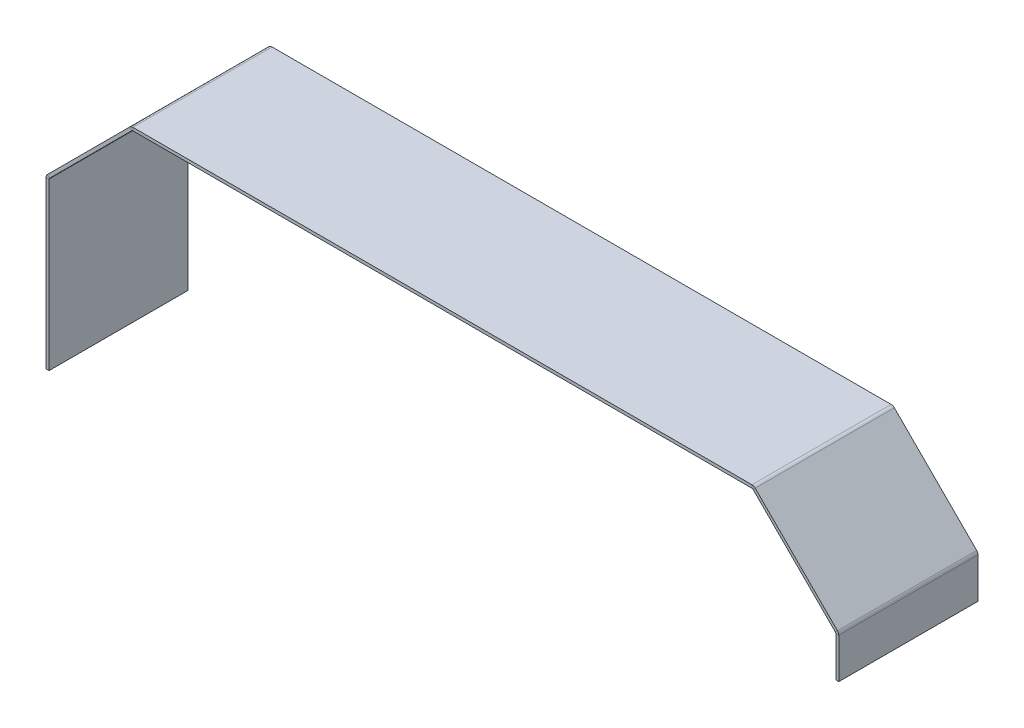
ISO-10303-21;
HEADER;
FILE_DESCRIPTION(('STEP AP214'),'2;1');
FILE_NAME('part.step','',(''),(''),'','','');
FILE_SCHEMA(('AUTOMOTIVE_DESIGN { 1 0 10303 214 1 1 1 1 }'));
ENDSEC;
DATA;
#1=APPLICATION_CONTEXT('core data for automotive mechanical design processes');
#2=APPLICATION_PROTOCOL_DEFINITION('international standard','automotive_design',2000,#1);
#3=PRODUCT_CONTEXT('',#1,'mechanical');
#4=PRODUCT('Part','Part','',(#3));
#5=PRODUCT_RELATED_PRODUCT_CATEGORY('part','',(#4));
#6=PRODUCT_DEFINITION_FORMATION('','',#4);
#7=PRODUCT_DEFINITION_CONTEXT('part definition',#1,'design');
#8=PRODUCT_DEFINITION('design','',#6,#7);
#9=PRODUCT_DEFINITION_SHAPE('','',#8);
#10=(LENGTH_UNIT() NAMED_UNIT(*) SI_UNIT(.MILLI.,.METRE.));
#11=(NAMED_UNIT(*) PLANE_ANGLE_UNIT() SI_UNIT($,.RADIAN.));
#12=(NAMED_UNIT(*) SI_UNIT($,.STERADIAN.) SOLID_ANGLE_UNIT());
#13=UNCERTAINTY_MEASURE_WITH_UNIT(LENGTH_MEASURE(1.E-05),#10,'distance_accuracy_value','');
#14=(GEOMETRIC_REPRESENTATION_CONTEXT(3) GLOBAL_UNCERTAINTY_ASSIGNED_CONTEXT((#13)) GLOBAL_UNIT_ASSIGNED_CONTEXT((#10,
#11,#12)) REPRESENTATION_CONTEXT('',''));
#15=CARTESIAN_POINT('',(0.,0.,0.));
#16=DIRECTION('',(0.,0.,1.));
#17=DIRECTION('',(1.,0.,0.));
#18=AXIS2_PLACEMENT_3D('',#15,#16,#17);
#19=CARTESIAN_POINT('',(465.,0.,0.));
#20=DIRECTION('',(0.,0.,1.));
#21=DIRECTION('',(-0.707106781186547,0.707106781186548,0.));
#22=AXIS2_PLACEMENT_3D('',#19,#20,#21);
#23=PLANE('',#22);
#24=DIRECTION('',(0.707106781186548,0.707106781186547,0.));
#25=VECTOR('',#24,1.);
#26=CARTESIAN_POINT('',(519.707106781187,-54.7071067811866,0.));
#27=LINE('',#26,#25);
#28=CARTESIAN_POINT('',(519.707106781187,-54.7071067811866,0.));
#29=VERTEX_POINT('',#28);
#30=CARTESIAN_POINT('',(521.12132034356,-53.2928932188135,0.));
#31=VERTEX_POINT('',#30);
#32=EDGE_CURVE('E11',#29,#31,#27,.T.);
#33=ORIENTED_EDGE('',*,*,#32,.F.);
#34=DIRECTION('',(-0.707106781186547,0.707106781186548,0.));
#35=VECTOR('',#34,1.);
#36=CARTESIAN_POINT('',(465.,0.,0.));
#37=LINE('',#36,#35);
#38=CARTESIAN_POINT('',(465.292893218813,-0.292893218813435,0.));
#39=VERTEX_POINT('',#38);
#40=EDGE_CURVE('E292',#29,#39,#37,.T.);
#41=ORIENTED_EDGE('',*,*,#40,.T.);
#42=DIRECTION('',(0.707106781186524,0.707106781186571,0.));
#43=VECTOR('',#42,1.);
#44=CARTESIAN_POINT('',(465.292893218813,-0.292893218813435,0.));
#45=LINE('',#44,#43);
#46=CARTESIAN_POINT('',(466.707106781187,1.12132034355966,0.));
#47=VERTEX_POINT('',#46);
#48=EDGE_CURVE('E55',#39,#47,#45,.T.);
#49=ORIENTED_EDGE('',*,*,#48,.T.);
#50=DIRECTION('',(0.707106781186547,-0.707106781186548,0.));
#51=VECTOR('',#50,1.);
#52=CARTESIAN_POINT('',(466.414213562373,1.41421356237309,0.));
#53=LINE('',#52,#51);
#54=EDGE_CURVE('E231',#31,#47,#53,.F.);
#55=ORIENTED_EDGE('',*,*,#54,.F.);
#56=EDGE_LOOP('',(#33,#41,#49,#55));
#57=FACE_BOUND('',#56,.T.);
#58=ADVANCED_FACE('F45',(#57),#23,.F.);
#59=CARTESIAN_POINT('',(464.585786437627,-1.,0.));
#60=DIRECTION('',(0.,0.,1.));
#61=DIRECTION('',(1.,0.,0.));
#62=AXIS2_PLACEMENT_3D('',#59,#60,#61);
#63=PLANE('',#62);
#64=ORIENTED_EDGE('',*,*,#48,.F.);
#65=CARTESIAN_POINT('',(464.585786437627,-1.,0.));
#66=DIRECTION('',(0.,0.,-1.));
#67=DIRECTION('',(-1.,0.,0.));
#68=AXIS2_PLACEMENT_3D('',#65,#66,#67);
#69=CIRCLE('',#68,1.);
#70=CARTESIAN_POINT('',(464.585786437627,0.,0.));
#71=VERTEX_POINT('',#70);
#72=EDGE_CURVE('E323',#39,#71,#69,.F.);
#73=ORIENTED_EDGE('',*,*,#72,.T.);
#74=DIRECTION('',(0.,1.,0.));
#75=VECTOR('',#74,1.);
#76=CARTESIAN_POINT('',(464.585786437627,0.,0.));
#77=LINE('',#76,#75);
#78=CARTESIAN_POINT('',(464.585786437627,2.,0.));
#79=VERTEX_POINT('',#78);
#80=EDGE_CURVE('E375',#71,#79,#77,.T.);
#81=ORIENTED_EDGE('',*,*,#80,.T.);
#82=CARTESIAN_POINT('',(464.585786437627,-1.,0.));
#83=DIRECTION('',(0.,0.,-1.));
#84=DIRECTION('',(-1.,0.,0.));
#85=AXIS2_PLACEMENT_3D('',#82,#83,#84);
#86=CIRCLE('',#85,3.);
#87=EDGE_CURVE('E235',#47,#79,#86,.F.);
#88=ORIENTED_EDGE('',*,*,#87,.F.);
#89=EDGE_LOOP('',(#64,#73,#81,#88));
#90=FACE_BOUND('',#89,.T.);
#91=ADVANCED_FACE('F390',(#90),#63,.F.);
#92=CARTESIAN_POINT('',(55.,0.,0.));
#93=DIRECTION('',(0.,0.,1.));
#94=DIRECTION('',(-1.,0.,0.));
#95=AXIS2_PLACEMENT_3D('',#92,#93,#94);
#96=PLANE('',#95);
#97=ORIENTED_EDGE('',*,*,#80,.F.);
#98=DIRECTION('',(-1.,0.,0.));
#99=VECTOR('',#98,1.);
#100=CARTESIAN_POINT('',(55.,0.,0.));
#101=LINE('',#100,#99);
#102=CARTESIAN_POINT('',(55.4142135623731,0.,0.));
#103=VERTEX_POINT('',#102);
#104=EDGE_CURVE('E278',#71,#103,#101,.T.);
#105=ORIENTED_EDGE('',*,*,#104,.T.);
#106=DIRECTION('',(0.,1.,0.));
#107=VECTOR('',#106,1.);
#108=CARTESIAN_POINT('',(55.4142135623731,0.,0.));
#109=LINE('',#108,#107);
#110=CARTESIAN_POINT('',(55.4142135623731,2.,0.));
#111=VERTEX_POINT('',#110);
#112=EDGE_CURVE('E373',#103,#111,#109,.T.);
#113=ORIENTED_EDGE('',*,*,#112,.T.);
#114=DIRECTION('',(1.,0.,0.));
#115=VECTOR('',#114,1.);
#116=CARTESIAN_POINT('',(55.,2.,0.));
#117=LINE('',#116,#115);
#118=EDGE_CURVE('E240',#79,#111,#117,.F.);
#119=ORIENTED_EDGE('',*,*,#118,.F.);
#120=EDGE_LOOP('',(#97,#105,#113,#119));
#121=FACE_BOUND('',#120,.T.);
#122=ADVANCED_FACE('F448',(#121),#96,.F.);
#123=CARTESIAN_POINT('',(55.4142135623731,-1.,0.));
#124=DIRECTION('',(0.,0.,1.));
#125=DIRECTION('',(1.,0.,0.));
#126=AXIS2_PLACEMENT_3D('',#123,#124,#125);
#127=PLANE('',#126);
#128=ORIENTED_EDGE('',*,*,#112,.F.);
#129=CARTESIAN_POINT('',(55.4142135623731,-1.,0.));
#130=DIRECTION('',(0.,0.,-1.));
#131=DIRECTION('',(-1.,0.,0.));
#132=AXIS2_PLACEMENT_3D('',#129,#130,#131);
#133=CIRCLE('',#132,1.);
#134=CARTESIAN_POINT('',(54.7071067811865,-0.292893218813456,0.));
#135=VERTEX_POINT('',#134);
#136=EDGE_CURVE('E335',#103,#135,#133,.F.);
#137=ORIENTED_EDGE('',*,*,#136,.T.);
#138=DIRECTION('',(-0.707106781186547,0.707106781186547,0.));
#139=VECTOR('',#138,1.);
#140=CARTESIAN_POINT('',(54.7071067811865,-0.292893218813456,0.));
#141=LINE('',#140,#139);
#142=CARTESIAN_POINT('',(53.2928932188134,1.12132034355964,0.));
#143=VERTEX_POINT('',#142);
#144=EDGE_CURVE('E371',#135,#143,#141,.T.);
#145=ORIENTED_EDGE('',*,*,#144,.T.);
#146=CARTESIAN_POINT('',(55.4142135623731,-1.,0.));
#147=DIRECTION('',(0.,0.,-1.));
#148=DIRECTION('',(-1.,0.,0.));
#149=AXIS2_PLACEMENT_3D('',#146,#147,#148);
#150=CIRCLE('',#149,3.);
#151=EDGE_CURVE('E244',#111,#143,#150,.F.);
#152=ORIENTED_EDGE('',*,*,#151,.F.);
#153=EDGE_LOOP('',(#128,#137,#145,#152));
#154=FACE_BOUND('',#153,.T.);
#155=ADVANCED_FACE('F442',(#154),#127,.F.);
#156=CARTESIAN_POINT('',(55.,0.,0.));
#157=DIRECTION('',(0.,0.,1.));
#158=DIRECTION('',(-0.707106781186548,-0.707106781186548,0.));
#159=AXIS2_PLACEMENT_3D('',#156,#157,#158);
#160=PLANE('',#159);
#161=ORIENTED_EDGE('',*,*,#144,.F.);
#162=DIRECTION('',(-0.707106781186548,-0.707106781186548,0.));
#163=VECTOR('',#162,1.);
#164=CARTESIAN_POINT('',(55.,0.,0.));
#165=LINE('',#164,#163);
#166=CARTESIAN_POINT('',(0.292893218813456,-54.7071067811865,0.));
#167=VERTEX_POINT('',#166);
#168=EDGE_CURVE('E272',#135,#167,#165,.T.);
#169=ORIENTED_EDGE('',*,*,#168,.T.);
#170=DIRECTION('',(-0.707106781186547,0.707106781186548,0.));
#171=VECTOR('',#170,1.);
#172=CARTESIAN_POINT('',(0.292893218813456,-54.7071067811865,0.));
#173=LINE('',#172,#171);
#174=CARTESIAN_POINT('',(-1.12132034355964,-53.2928932188134,0.));
#175=VERTEX_POINT('',#174);
#176=EDGE_CURVE('E63',#167,#175,#173,.T.);
#177=ORIENTED_EDGE('',*,*,#176,.T.);
#178=DIRECTION('',(0.707106781186548,0.707106781186548,0.));
#179=VECTOR('',#178,1.);
#180=CARTESIAN_POINT('',(53.5857864376269,1.41421356237309,0.));
#181=LINE('',#180,#179);
#182=EDGE_CURVE('E227',#143,#175,#181,.F.);
#183=ORIENTED_EDGE('',*,*,#182,.F.);
#184=EDGE_LOOP('',(#161,#169,#177,#183));
#185=FACE_BOUND('',#184,.T.);
#186=ADVANCED_FACE('F434',(#185),#160,.F.);
#187=CARTESIAN_POINT('',(0.999999999999999,-55.4142135623731,0.));
#188=DIRECTION('',(0.,0.,1.));
#189=DIRECTION('',(1.,0.,0.));
#190=AXIS2_PLACEMENT_3D('',#187,#188,#189);
#191=PLANE('',#190);
#192=ORIENTED_EDGE('',*,*,#176,.F.);
#193=CARTESIAN_POINT('',(0.999999999999999,-55.4142135623731,0.));
#194=DIRECTION('',(0.,0.,-1.));
#195=DIRECTION('',(-1.,0.,0.));
#196=AXIS2_PLACEMENT_3D('',#193,#194,#195);
#197=CIRCLE('',#196,1.);
#198=CARTESIAN_POINT('',(0.,-55.4142135623731,0.));
#199=VERTEX_POINT('',#198);
#200=EDGE_CURVE('E344',#167,#199,#197,.F.);
#201=ORIENTED_EDGE('',*,*,#200,.T.);
#202=DIRECTION('',(-1.,0.,0.));
#203=VECTOR('',#202,1.);
#204=CARTESIAN_POINT('',(0.,-55.4142135623731,0.));
#205=LINE('',#204,#203);
#206=CARTESIAN_POINT('',(-2.,-55.4142135623731,0.));
#207=VERTEX_POINT('',#206);
#208=EDGE_CURVE('E367',#199,#207,#205,.T.);
#209=ORIENTED_EDGE('',*,*,#208,.T.);
#210=CARTESIAN_POINT('',(0.999999999999999,-55.4142135623731,0.));
#211=DIRECTION('',(0.,0.,-1.));
#212=DIRECTION('',(-1.,0.,0.));
#213=AXIS2_PLACEMENT_3D('',#210,#211,#212);
#214=CIRCLE('',#213,3.);
#215=EDGE_CURVE('E250',#175,#207,#214,.F.);
#216=ORIENTED_EDGE('',*,*,#215,.F.);
#217=EDGE_LOOP('',(#192,#201,#209,#216));
#218=FACE_BOUND('',#217,.T.);
#219=ADVANCED_FACE('F432',(#218),#191,.F.);
#220=CARTESIAN_POINT('',(0.,-55.,0.));
#221=DIRECTION('',(0.,0.,1.));
#222=DIRECTION('',(0.,-1.,0.));
#223=AXIS2_PLACEMENT_3D('',#220,#221,#222);
#224=PLANE('',#223);
#225=ORIENTED_EDGE('',*,*,#208,.F.);
#226=DIRECTION('',(0.,-1.,0.));
#227=VECTOR('',#226,1.);
#228=CARTESIAN_POINT('',(0.,-55.,0.));
#229=LINE('',#228,#227);
#230=CARTESIAN_POINT('',(0.,-165.,0.));
#231=VERTEX_POINT('',#230);
#232=EDGE_CURVE('E284',#199,#231,#229,.T.);
#233=ORIENTED_EDGE('',*,*,#232,.T.);
#234=DIRECTION('',(-1.,0.,0.));
#235=VECTOR('',#234,1.);
#236=CARTESIAN_POINT('',(0.,-165.,0.));
#237=LINE('',#236,#235);
#238=CARTESIAN_POINT('',(-1.99999999999999,-165.,0.));
#239=VERTEX_POINT('',#238);
#240=EDGE_CURVE('E166',#231,#239,#237,.T.);
#241=ORIENTED_EDGE('',*,*,#240,.T.);
#242=DIRECTION('',(0.,1.,0.));
#243=VECTOR('',#242,1.);
#244=CARTESIAN_POINT('',(-2.,-55.,0.));
#245=LINE('',#244,#243);
#246=EDGE_CURVE('E239',#207,#239,#245,.F.);
#247=ORIENTED_EDGE('',*,*,#246,.F.);
#248=EDGE_LOOP('',(#225,#233,#241,#247));
#249=FACE_BOUND('',#248,.T.);
#250=ADVANCED_FACE('F421',(#249),#224,.F.);
#251=CARTESIAN_POINT('',(0.,-165.,92.));
#252=DIRECTION('',(0.,-1.,0.));
#253=DIRECTION('',(0.,0.,-1.));
#254=AXIS2_PLACEMENT_3D('',#251,#252,#253);
#255=PLANE('',#254);
#256=ORIENTED_EDGE('',*,*,#240,.F.);
#257=DIRECTION('',(0.,0.,-1.));
#258=VECTOR('',#257,1.);
#259=CARTESIAN_POINT('',(0.,-165.,92.));
#260=LINE('',#259,#258);
#261=CARTESIAN_POINT('',(0.,-165.,92.));
#262=VERTEX_POINT('',#261);
#263=EDGE_CURVE('E286',#262,#231,#260,.T.);
#264=ORIENTED_EDGE('',*,*,#263,.F.);
#265=DIRECTION('',(-1.,0.,0.));
#266=VECTOR('',#265,1.);
#267=CARTESIAN_POINT('',(0.,-165.,92.));
#268=LINE('',#267,#266);
#269=CARTESIAN_POINT('',(-1.99999999999999,-165.,92.));
#270=VERTEX_POINT('',#269);
#271=EDGE_CURVE('E364',#262,#270,#268,.T.);
#272=ORIENTED_EDGE('',*,*,#271,.T.);
#273=DIRECTION('',(0.,0.,1.));
#274=VECTOR('',#273,1.);
#275=CARTESIAN_POINT('',(-1.99999999999999,-165.,92.));
#276=LINE('',#275,#274);
#277=EDGE_CURVE('E254',#270,#239,#276,.F.);
#278=ORIENTED_EDGE('',*,*,#277,.T.);
#279=EDGE_LOOP('',(#256,#264,#272,#278));
#280=FACE_BOUND('',#279,.T.);
#281=ADVANCED_FACE('F440',(#280),#255,.T.);
#282=CARTESIAN_POINT('',(0.,-55.,92.));
#283=DIRECTION('',(0.,0.,1.));
#284=DIRECTION('',(0.,-1.,0.));
#285=AXIS2_PLACEMENT_3D('',#282,#283,#284);
#286=PLANE('',#285);
#287=ORIENTED_EDGE('',*,*,#271,.F.);
#288=DIRECTION('',(0.,-1.,0.));
#289=VECTOR('',#288,1.);
#290=CARTESIAN_POINT('',(0.,-55.,92.));
#291=LINE('',#290,#289);
#292=CARTESIAN_POINT('',(0.,-55.4142135623731,92.));
#293=VERTEX_POINT('',#292);
#294=EDGE_CURVE('E289',#293,#262,#291,.T.);
#295=ORIENTED_EDGE('',*,*,#294,.F.);
#296=DIRECTION('',(-1.,0.,0.));
#297=VECTOR('',#296,1.);
#298=CARTESIAN_POINT('',(0.,-55.4142135623731,92.));
#299=LINE('',#298,#297);
#300=CARTESIAN_POINT('',(-2.,-55.4142135623731,92.));
#301=VERTEX_POINT('',#300);
#302=EDGE_CURVE('E362',#293,#301,#299,.T.);
#303=ORIENTED_EDGE('',*,*,#302,.T.);
#304=DIRECTION('',(0.,1.,0.));
#305=VECTOR('',#304,1.);
#306=CARTESIAN_POINT('',(-2.,-55.,92.));
#307=LINE('',#306,#305);
#308=EDGE_CURVE('E251',#301,#270,#307,.F.);
#309=ORIENTED_EDGE('',*,*,#308,.T.);
#310=EDGE_LOOP('',(#287,#295,#303,#309));
#311=FACE_BOUND('',#310,.T.);
#312=ADVANCED_FACE('F495',(#311),#286,.T.);
#313=CARTESIAN_POINT('',(0.999999999999999,-55.4142135623731,92.));
#314=DIRECTION('',(0.,0.,-1.));
#315=DIRECTION('',(-1.,0.,0.));
#316=AXIS2_PLACEMENT_3D('',#313,#314,#315);
#317=PLANE('',#316);
#318=ORIENTED_EDGE('',*,*,#302,.F.);
#319=CARTESIAN_POINT('',(0.999999999999999,-55.4142135623731,92.));
#320=DIRECTION('',(0.,0.,1.));
#321=DIRECTION('',(1.,0.,0.));
#322=AXIS2_PLACEMENT_3D('',#319,#320,#321);
#323=CIRCLE('',#322,1.);
#324=CARTESIAN_POINT('',(0.292893218813456,-54.7071067811865,92.));
#325=VERTEX_POINT('',#324);
#326=EDGE_CURVE('E338',#293,#325,#323,.F.);
#327=ORIENTED_EDGE('',*,*,#326,.T.);
#328=DIRECTION('',(-0.707106781186547,0.707106781186547,0.));
#329=VECTOR('',#328,1.);
#330=CARTESIAN_POINT('',(0.292893218813456,-54.7071067811865,92.));
#331=LINE('',#330,#329);
#332=CARTESIAN_POINT('',(-1.12132034355964,-53.2928932188134,92.));
#333=VERTEX_POINT('',#332);
#334=EDGE_CURVE('E154',#325,#333,#331,.T.);
#335=ORIENTED_EDGE('',*,*,#334,.T.);
#336=CARTESIAN_POINT('',(0.999999999999999,-55.4142135623731,92.));
#337=DIRECTION('',(0.,0.,-1.));
#338=DIRECTION('',(-1.,0.,0.));
#339=AXIS2_PLACEMENT_3D('',#336,#337,#338);
#340=CIRCLE('',#339,3.);
#341=EDGE_CURVE('E247',#301,#333,#340,.T.);
#342=ORIENTED_EDGE('',*,*,#341,.F.);
#343=EDGE_LOOP('',(#318,#327,#335,#342));
#344=FACE_BOUND('',#343,.T.);
#345=ADVANCED_FACE('F493',(#344),#317,.F.);
#346=CARTESIAN_POINT('',(55.,0.,92.));
#347=DIRECTION('',(0.,0.,1.));
#348=DIRECTION('',(-0.707106781186548,-0.707106781186548,0.));
#349=AXIS2_PLACEMENT_3D('',#346,#347,#348);
#350=PLANE('',#349);
#351=ORIENTED_EDGE('',*,*,#334,.F.);
#352=DIRECTION('',(-0.707106781186548,-0.707106781186548,0.));
#353=VECTOR('',#352,1.);
#354=CARTESIAN_POINT('',(55.,0.,92.));
#355=LINE('',#354,#353);
#356=CARTESIAN_POINT('',(54.7071067811865,-0.292893218813456,92.));
#357=VERTEX_POINT('',#356);
#358=EDGE_CURVE('E274',#357,#325,#355,.T.);
#359=ORIENTED_EDGE('',*,*,#358,.F.);
#360=DIRECTION('',(-0.707106781186548,0.707106781186547,0.));
#361=VECTOR('',#360,1.);
#362=CARTESIAN_POINT('',(54.7071067811865,-0.292893218813456,92.));
#363=LINE('',#362,#361);
#364=CARTESIAN_POINT('',(53.2928932188134,1.12132034355964,92.));
#365=VERTEX_POINT('',#364);
#366=EDGE_CURVE('E359',#357,#365,#363,.T.);
#367=ORIENTED_EDGE('',*,*,#366,.T.);
#368=DIRECTION('',(0.707106781186548,0.707106781186548,0.));
#369=VECTOR('',#368,1.);
#370=CARTESIAN_POINT('',(53.5857864376269,1.41421356237309,92.));
#371=LINE('',#370,#369);
#372=EDGE_CURVE('E245',#365,#333,#371,.F.);
#373=ORIENTED_EDGE('',*,*,#372,.T.);
#374=EDGE_LOOP('',(#351,#359,#367,#373));
#375=FACE_BOUND('',#374,.T.);
#376=ADVANCED_FACE('F489',(#375),#350,.T.);
#377=CARTESIAN_POINT('',(55.4142135623731,-1.,92.));
#378=DIRECTION('',(0.,0.,-1.));
#379=DIRECTION('',(-1.,0.,0.));
#380=AXIS2_PLACEMENT_3D('',#377,#378,#379);
#381=PLANE('',#380);
#382=ORIENTED_EDGE('',*,*,#366,.F.);
#383=CARTESIAN_POINT('',(55.4142135623731,-1.,92.));
#384=DIRECTION('',(0.,0.,1.));
#385=DIRECTION('',(1.,0.,0.));
#386=AXIS2_PLACEMENT_3D('',#383,#384,#385);
#387=CIRCLE('',#386,1.);
#388=CARTESIAN_POINT('',(55.4142135623731,0.,92.));
#389=VERTEX_POINT('',#388);
#390=EDGE_CURVE('E326',#357,#389,#387,.F.);
#391=ORIENTED_EDGE('',*,*,#390,.T.);
#392=DIRECTION('',(0.,1.,0.));
#393=VECTOR('',#392,1.);
#394=CARTESIAN_POINT('',(55.4142135623731,0.,92.));
#395=LINE('',#394,#393);
#396=CARTESIAN_POINT('',(55.4142135623731,2.,92.));
#397=VERTEX_POINT('',#396);
#398=EDGE_CURVE('E357',#389,#397,#395,.T.);
#399=ORIENTED_EDGE('',*,*,#398,.T.);
#400=CARTESIAN_POINT('',(55.4142135623731,-1.,92.));
#401=DIRECTION('',(0.,0.,-1.));
#402=DIRECTION('',(-1.,0.,0.));
#403=AXIS2_PLACEMENT_3D('',#400,#401,#402);
#404=CIRCLE('',#403,3.);
#405=EDGE_CURVE('E241',#365,#397,#404,.T.);
#406=ORIENTED_EDGE('',*,*,#405,.F.);
#407=EDGE_LOOP('',(#382,#391,#399,#406));
#408=FACE_BOUND('',#407,.T.);
#409=ADVANCED_FACE('F482',(#408),#381,.F.);
#410=CARTESIAN_POINT('',(55.,0.,92.));
#411=DIRECTION('',(0.,0.,1.));
#412=DIRECTION('',(-1.,0.,0.));
#413=AXIS2_PLACEMENT_3D('',#410,#411,#412);
#414=PLANE('',#413);
#415=ORIENTED_EDGE('',*,*,#398,.F.);
#416=DIRECTION('',(-1.,0.,0.));
#417=VECTOR('',#416,1.);
#418=CARTESIAN_POINT('',(55.,0.,92.));
#419=LINE('',#418,#417);
#420=CARTESIAN_POINT('',(464.585786437627,0.,92.));
#421=VERTEX_POINT('',#420);
#422=EDGE_CURVE('E281',#421,#389,#419,.T.);
#423=ORIENTED_EDGE('',*,*,#422,.F.);
#424=DIRECTION('',(0.,1.,0.));
#425=VECTOR('',#424,1.);
#426=CARTESIAN_POINT('',(464.585786437627,0.,92.));
#427=LINE('',#426,#425);
#428=CARTESIAN_POINT('',(464.585786437627,2.,92.));
#429=VERTEX_POINT('',#428);
#430=EDGE_CURVE('E355',#421,#429,#427,.T.);
#431=ORIENTED_EDGE('',*,*,#430,.T.);
#432=DIRECTION('',(1.,0.,0.));
#433=VECTOR('',#432,1.);
#434=CARTESIAN_POINT('',(55.,2.,92.));
#435=LINE('',#434,#433);
#436=EDGE_CURVE('E236',#429,#397,#435,.F.);
#437=ORIENTED_EDGE('',*,*,#436,.T.);
#438=EDGE_LOOP('',(#415,#423,#431,#437));
#439=FACE_BOUND('',#438,.T.);
#440=ADVANCED_FACE('F478',(#439),#414,.T.);
#441=CARTESIAN_POINT('',(464.585786437627,-1.,92.));
#442=DIRECTION('',(0.,0.,-1.));
#443=DIRECTION('',(-1.,0.,0.));
#444=AXIS2_PLACEMENT_3D('',#441,#442,#443);
#445=PLANE('',#444);
#446=ORIENTED_EDGE('',*,*,#430,.F.);
#447=CARTESIAN_POINT('',(464.585786437627,-1.,92.));
#448=DIRECTION('',(0.,0.,1.));
#449=DIRECTION('',(1.,0.,0.));
#450=AXIS2_PLACEMENT_3D('',#447,#448,#449);
#451=CIRCLE('',#450,1.);
#452=CARTESIAN_POINT('',(465.292893218813,-0.292893218813435,92.));
#453=VERTEX_POINT('',#452);
#454=EDGE_CURVE('E314',#421,#453,#451,.F.);
#455=ORIENTED_EDGE('',*,*,#454,.T.);
#456=DIRECTION('',(0.707106781186548,0.707106781186547,0.));
#457=VECTOR('',#456,1.);
#458=CARTESIAN_POINT('',(465.292893218813,-0.292893218813435,92.));
#459=LINE('',#458,#457);
#460=CARTESIAN_POINT('',(466.707106781186,1.12132034355971,92.));
#461=VERTEX_POINT('',#460);
#462=EDGE_CURVE('E353',#453,#461,#459,.T.);
#463=ORIENTED_EDGE('',*,*,#462,.T.);
#464=CARTESIAN_POINT('',(464.585786437627,-1.,92.));
#465=DIRECTION('',(0.,0.,-1.));
#466=DIRECTION('',(-1.,0.,0.));
#467=AXIS2_PLACEMENT_3D('',#464,#465,#466);
#468=CIRCLE('',#467,3.);
#469=EDGE_CURVE('E232',#429,#461,#468,.T.);
#470=ORIENTED_EDGE('',*,*,#469,.F.);
#471=EDGE_LOOP('',(#446,#455,#463,#470));
#472=FACE_BOUND('',#471,.T.);
#473=ADVANCED_FACE('F512',(#472),#445,.F.);
#474=CARTESIAN_POINT('',(465.,0.,92.));
#475=DIRECTION('',(0.,0.,1.));
#476=DIRECTION('',(-0.707106781186547,0.707106781186548,0.));
#477=AXIS2_PLACEMENT_3D('',#474,#475,#476);
#478=PLANE('',#477);
#479=ORIENTED_EDGE('',*,*,#462,.F.);
#480=DIRECTION('',(-0.707106781186547,0.707106781186548,0.));
#481=VECTOR('',#480,1.);
#482=CARTESIAN_POINT('',(465.,0.,92.));
#483=LINE('',#482,#481);
#484=CARTESIAN_POINT('',(519.707106781187,-54.7071067811866,92.));
#485=VERTEX_POINT('',#484);
#486=EDGE_CURVE('E295',#485,#453,#483,.T.);
#487=ORIENTED_EDGE('',*,*,#486,.F.);
#488=DIRECTION('',(0.707106781186561,0.707106781186534,0.));
#489=VECTOR('',#488,1.);
#490=CARTESIAN_POINT('',(519.707106781187,-54.7071067811866,92.));
#491=LINE('',#490,#489);
#492=CARTESIAN_POINT('',(521.12132034356,-53.2928932188135,92.));
#493=VERTEX_POINT('',#492);
#494=EDGE_CURVE('E351',#485,#493,#491,.T.);
#495=ORIENTED_EDGE('',*,*,#494,.T.);
#496=DIRECTION('',(0.707106781186547,-0.707106781186548,0.));
#497=VECTOR('',#496,1.);
#498=CARTESIAN_POINT('',(466.414213562373,1.41421356237309,92.));
#499=LINE('',#498,#497);
#500=EDGE_CURVE('E211',#493,#461,#499,.F.);
#501=ORIENTED_EDGE('',*,*,#500,.T.);
#502=EDGE_LOOP('',(#479,#487,#495,#501));
#503=FACE_BOUND('',#502,.T.);
#504=ADVANCED_FACE('F515',(#503),#478,.T.);
#505=CARTESIAN_POINT('',(519.,-55.4142135623731,92.));
#506=DIRECTION('',(0.,0.,-1.));
#507=DIRECTION('',(-1.,0.,0.));
#508=AXIS2_PLACEMENT_3D('',#505,#506,#507);
#509=PLANE('',#508);
#510=ORIENTED_EDGE('',*,*,#494,.F.);
#511=CARTESIAN_POINT('',(519.,-55.4142135623731,92.));
#512=DIRECTION('',(0.,0.,1.));
#513=DIRECTION('',(1.,0.,0.));
#514=AXIS2_PLACEMENT_3D('',#511,#512,#513);
#515=CIRCLE('',#514,1.);
#516=CARTESIAN_POINT('',(520.,-55.4142135623731,92.));
#517=VERTEX_POINT('',#516);
#518=EDGE_CURVE('E275',#485,#517,#515,.F.);
#519=ORIENTED_EDGE('',*,*,#518,.T.);
#520=DIRECTION('',(1.,0.,0.));
#521=VECTOR('',#520,1.);
#522=CARTESIAN_POINT('',(520.,-55.4142135623731,92.));
#523=LINE('',#522,#521);
#524=CARTESIAN_POINT('',(522.,-55.4142135623731,92.));
#525=VERTEX_POINT('',#524);
#526=EDGE_CURVE('E349',#517,#525,#523,.T.);
#527=ORIENTED_EDGE('',*,*,#526,.T.);
#528=CARTESIAN_POINT('',(519.,-55.4142135623731,92.));
#529=DIRECTION('',(0.,0.,-1.));
#530=DIRECTION('',(-1.,0.,0.));
#531=AXIS2_PLACEMENT_3D('',#528,#529,#530);
#532=CIRCLE('',#531,3.);
#533=EDGE_CURVE('E224',#493,#525,#532,.T.);
#534=ORIENTED_EDGE('',*,*,#533,.F.);
#535=EDGE_LOOP('',(#510,#519,#527,#534));
#536=FACE_BOUND('',#535,.T.);
#537=ADVANCED_FACE('F518',(#536),#509,.F.);
#538=CARTESIAN_POINT('',(520.,-55.,92.));
#539=DIRECTION('',(0.,0.,1.));
#540=DIRECTION('',(0.,1.,0.));
#541=AXIS2_PLACEMENT_3D('',#538,#539,#540);
#542=PLANE('',#541);
#543=ORIENTED_EDGE('',*,*,#526,.F.);
#544=DIRECTION('',(0.,1.,0.));
#545=VECTOR('',#544,1.);
#546=CARTESIAN_POINT('',(520.,-55.,92.));
#547=LINE('',#546,#545);
#548=CARTESIAN_POINT('',(520.,-82.,92.));
#549=VERTEX_POINT('',#548);
#550=EDGE_CURVE('E300',#549,#517,#547,.T.);
#551=ORIENTED_EDGE('',*,*,#550,.F.);
#552=DIRECTION('',(1.,0.,0.));
#553=VECTOR('',#552,1.);
#554=CARTESIAN_POINT('',(520.,-82.,92.));
#555=LINE('',#554,#553);
#556=CARTESIAN_POINT('',(522.,-82.,92.));
#557=VERTEX_POINT('',#556);
#558=EDGE_CURVE('E202',#549,#557,#555,.T.);
#559=ORIENTED_EDGE('',*,*,#558,.T.);
#560=DIRECTION('',(0.,1.,0.));
#561=VECTOR('',#560,1.);
#562=CARTESIAN_POINT('',(522.,-55.,92.));
#563=LINE('',#562,#561);
#564=EDGE_CURVE('E210',#557,#525,#563,.T.);
#565=ORIENTED_EDGE('',*,*,#564,.T.);
#566=EDGE_LOOP('',(#543,#551,#559,#565));
#567=FACE_BOUND('',#566,.T.);
#568=ADVANCED_FACE('F522',(#567),#542,.T.);
#569=CARTESIAN_POINT('',(520.,-82.,92.));
#570=DIRECTION('',(0.,1.,0.));
#571=DIRECTION('',(0.,0.,-1.));
#572=AXIS2_PLACEMENT_3D('',#569,#570,#571);
#573=PLANE('',#572);
#574=ORIENTED_EDGE('',*,*,#558,.F.);
#575=DIRECTION('',(0.,0.,-1.));
#576=VECTOR('',#575,1.);
#577=CARTESIAN_POINT('',(520.,-82.,92.));
#578=LINE('',#577,#576);
#579=CARTESIAN_POINT('',(520.,-82.,0.));
#580=VERTEX_POINT('',#579);
#581=EDGE_CURVE('E198',#549,#580,#578,.T.);
#582=ORIENTED_EDGE('',*,*,#581,.T.);
#583=DIRECTION('',(1.,0.,0.));
#584=VECTOR('',#583,1.);
#585=CARTESIAN_POINT('',(520.,-82.,0.));
#586=LINE('',#585,#584);
#587=CARTESIAN_POINT('',(522.,-82.,0.));
#588=VERTEX_POINT('',#587);
#589=EDGE_CURVE('E192',#580,#588,#586,.T.);
#590=ORIENTED_EDGE('',*,*,#589,.T.);
#591=DIRECTION('',(0.,0.,1.));
#592=VECTOR('',#591,1.);
#593=CARTESIAN_POINT('',(522.,-82.,92.));
#594=LINE('',#593,#592);
#595=EDGE_CURVE('E196',#557,#588,#594,.F.);
#596=ORIENTED_EDGE('',*,*,#595,.F.);
#597=EDGE_LOOP('',(#574,#582,#590,#596));
#598=FACE_BOUND('',#597,.T.);
#599=ADVANCED_FACE('F194',(#598),#573,.F.);
#600=CARTESIAN_POINT('',(520.,-55.,0.));
#601=DIRECTION('',(0.,0.,1.));
#602=DIRECTION('',(0.,1.,0.));
#603=AXIS2_PLACEMENT_3D('',#600,#601,#602);
#604=PLANE('',#603);
#605=ORIENTED_EDGE('',*,*,#589,.F.);
#606=DIRECTION('',(0.,1.,0.));
#607=VECTOR('',#606,1.);
#608=CARTESIAN_POINT('',(520.,-55.,0.));
#609=LINE('',#608,#607);
#610=CARTESIAN_POINT('',(520.,-55.4142135623731,0.));
#611=VERTEX_POINT('',#610);
#612=EDGE_CURVE('E298',#580,#611,#609,.T.);
#613=ORIENTED_EDGE('',*,*,#612,.T.);
#614=DIRECTION('',(1.,0.,0.));
#615=VECTOR('',#614,1.);
#616=CARTESIAN_POINT('',(520.,-55.4142135623731,0.));
#617=LINE('',#616,#615);
#618=CARTESIAN_POINT('',(522.,-55.4142135623731,0.));
#619=VERTEX_POINT('',#618);
#620=EDGE_CURVE('E49',#611,#619,#617,.T.);
#621=ORIENTED_EDGE('',*,*,#620,.T.);
#622=DIRECTION('',(0.,1.,0.));
#623=VECTOR('',#622,1.);
#624=CARTESIAN_POINT('',(522.,-55.,0.));
#625=LINE('',#624,#623);
#626=EDGE_CURVE('E205',#588,#619,#625,.T.);
#627=ORIENTED_EDGE('',*,*,#626,.F.);
#628=EDGE_LOOP('',(#605,#613,#621,#627));
#629=FACE_BOUND('',#628,.T.);
#630=ADVANCED_FACE('F206',(#629),#604,.F.);
#631=CARTESIAN_POINT('',(519.,-55.4142135623731,0.));
#632=DIRECTION('',(0.,0.,1.));
#633=DIRECTION('',(1.,0.,0.));
#634=AXIS2_PLACEMENT_3D('',#631,#632,#633);
#635=PLANE('',#634);
#636=CARTESIAN_POINT('',(519.,-55.4142135623731,0.));
#637=DIRECTION('',(0.,0.,-1.));
#638=DIRECTION('',(-1.,0.,0.));
#639=AXIS2_PLACEMENT_3D('',#636,#637,#638);
#640=CIRCLE('',#639,1.);
#641=EDGE_CURVE('E311',#611,#29,#640,.F.);
#642=ORIENTED_EDGE('',*,*,#641,.T.);
#643=ORIENTED_EDGE('',*,*,#32,.T.);
#644=CARTESIAN_POINT('',(519.,-55.4142135623731,0.));
#645=DIRECTION('',(0.,0.,-1.));
#646=DIRECTION('',(-1.,0.,0.));
#647=AXIS2_PLACEMENT_3D('',#644,#645,#646);
#648=CIRCLE('',#647,3.);
#649=EDGE_CURVE('E228',#619,#31,#648,.F.);
#650=ORIENTED_EDGE('',*,*,#649,.F.);
#651=ORIENTED_EDGE('',*,*,#620,.F.);
#652=EDGE_LOOP('',(#642,#643,#650,#651));
#653=FACE_BOUND('',#652,.T.);
#654=ADVANCED_FACE('F47',(#653),#635,.F.);
#655=CARTESIAN_POINT('',(522.,-55.,92.));
#656=DIRECTION('',(-1.,0.,0.));
#657=DIRECTION('',(0.,0.,1.));
#658=AXIS2_PLACEMENT_3D('',#655,#656,#657);
#659=PLANE('',#658);
#660=ORIENTED_EDGE('',*,*,#626,.T.);
#661=DIRECTION('',(0.,0.,1.));
#662=VECTOR('',#661,1.);
#663=CARTESIAN_POINT('',(522.,-55.4142135623731,92.));
#664=LINE('',#663,#662);
#665=EDGE_CURVE('E219',#619,#525,#664,.T.);
#666=ORIENTED_EDGE('',*,*,#665,.T.);
#667=ORIENTED_EDGE('',*,*,#564,.F.);
#668=ORIENTED_EDGE('',*,*,#595,.T.);
#669=EDGE_LOOP('',(#660,#666,#667,#668));
#670=FACE_BOUND('',#669,.T.);
#671=ADVANCED_FACE('F214',(#670),#659,.F.);
#672=CARTESIAN_POINT('',(466.414213562373,1.41421356237309,92.));
#673=DIRECTION('',(-0.707106781186548,-0.707106781186547,0.));
#674=DIRECTION('',(0.707106781186547,-0.707106781186548,0.));
#675=AXIS2_PLACEMENT_3D('',#672,#673,#674);
#676=PLANE('',#675);
#677=ORIENTED_EDGE('',*,*,#54,.T.);
#678=DIRECTION('',(0.,0.,1.));
#679=VECTOR('',#678,1.);
#680=CARTESIAN_POINT('',(466.707106781187,1.12132034355966,92.));
#681=LINE('',#680,#679);
#682=EDGE_CURVE('E388',#47,#461,#681,.T.);
#683=ORIENTED_EDGE('',*,*,#682,.T.);
#684=ORIENTED_EDGE('',*,*,#500,.F.);
#685=DIRECTION('',(0.,0.,1.));
#686=VECTOR('',#685,1.);
#687=CARTESIAN_POINT('',(521.12132034356,-53.2928932188135,92.));
#688=LINE('',#687,#686);
#689=EDGE_CURVE('E216',#493,#31,#688,.F.);
#690=ORIENTED_EDGE('',*,*,#689,.T.);
#691=EDGE_LOOP('',(#677,#683,#684,#690));
#692=FACE_BOUND('',#691,.T.);
#693=ADVANCED_FACE('F385',(#692),#676,.F.);
#694=CARTESIAN_POINT('',(-2.,-55.,92.));
#695=DIRECTION('',(1.,0.,0.));
#696=DIRECTION('',(0.,1.,0.));
#697=AXIS2_PLACEMENT_3D('',#694,#695,#696);
#698=PLANE('',#697);
#699=ORIENTED_EDGE('',*,*,#308,.F.);
#700=DIRECTION('',(0.,0.,1.));
#701=VECTOR('',#700,1.);
#702=CARTESIAN_POINT('',(-2.,-55.4142135623731,92.));
#703=LINE('',#702,#701);
#704=EDGE_CURVE('E407',#301,#207,#703,.F.);
#705=ORIENTED_EDGE('',*,*,#704,.T.);
#706=ORIENTED_EDGE('',*,*,#246,.T.);
#707=ORIENTED_EDGE('',*,*,#277,.F.);
#708=EDGE_LOOP('',(#699,#705,#706,#707));
#709=FACE_BOUND('',#708,.T.);
#710=ADVANCED_FACE('F415',(#709),#698,.F.);
#711=CARTESIAN_POINT('',(55.,2.,92.));
#712=DIRECTION('',(0.,-1.,0.));
#713=DIRECTION('',(0.,0.,-1.));
#714=AXIS2_PLACEMENT_3D('',#711,#712,#713);
#715=PLANE('',#714);
#716=ORIENTED_EDGE('',*,*,#118,.T.);
#717=DIRECTION('',(0.,0.,-1.));
#718=VECTOR('',#717,1.);
#719=CARTESIAN_POINT('',(55.4142135623731,2.,92.));
#720=LINE('',#719,#718);
#721=EDGE_CURVE('E400',#111,#397,#720,.F.);
#722=ORIENTED_EDGE('',*,*,#721,.T.);
#723=ORIENTED_EDGE('',*,*,#436,.F.);
#724=DIRECTION('',(0.,0.,-1.));
#725=VECTOR('',#724,1.);
#726=CARTESIAN_POINT('',(464.585786437627,2.,92.));
#727=LINE('',#726,#725);
#728=EDGE_CURVE('E397',#429,#79,#727,.T.);
#729=ORIENTED_EDGE('',*,*,#728,.T.);
#730=EDGE_LOOP('',(#716,#722,#723,#729));
#731=FACE_BOUND('',#730,.T.);
#732=ADVANCED_FACE('F567',(#731),#715,.F.);
#733=CARTESIAN_POINT('',(53.5857864376269,1.41421356237309,92.));
#734=DIRECTION('',(0.707106781186547,-0.707106781186547,0.));
#735=DIRECTION('',(0.707106781186548,0.707106781186548,0.));
#736=AXIS2_PLACEMENT_3D('',#733,#734,#735);
#737=PLANE('',#736);
#738=ORIENTED_EDGE('',*,*,#182,.T.);
#739=DIRECTION('',(0.,0.,1.));
#740=VECTOR('',#739,1.);
#741=CARTESIAN_POINT('',(-1.12132034355964,-53.2928932188134,92.));
#742=LINE('',#741,#740);
#743=EDGE_CURVE('E409',#175,#333,#742,.T.);
#744=ORIENTED_EDGE('',*,*,#743,.T.);
#745=ORIENTED_EDGE('',*,*,#372,.F.);
#746=DIRECTION('',(0.,0.,1.));
#747=VECTOR('',#746,1.);
#748=CARTESIAN_POINT('',(53.2928932188134,1.12132034355964,92.));
#749=LINE('',#748,#747);
#750=EDGE_CURVE('E396',#365,#143,#749,.F.);
#751=ORIENTED_EDGE('',*,*,#750,.T.);
#752=EDGE_LOOP('',(#738,#744,#745,#751));
#753=FACE_BOUND('',#752,.T.);
#754=ADVANCED_FACE('F488',(#753),#737,.F.);
#755=CARTESIAN_POINT('',(519.,-55.4142135623731,92.));
#756=DIRECTION('',(0.,0.,-1.));
#757=DIRECTION('',(-1.,0.,0.));
#758=AXIS2_PLACEMENT_3D('',#755,#756,#757);
#759=CYLINDRICAL_SURFACE('',#758,3.);
#760=ORIENTED_EDGE('',*,*,#533,.T.);
#761=ORIENTED_EDGE('',*,*,#665,.F.);
#762=ORIENTED_EDGE('',*,*,#649,.T.);
#763=ORIENTED_EDGE('',*,*,#689,.F.);
#764=EDGE_LOOP('',(#760,#761,#762,#763));
#765=FACE_BOUND('',#764,.T.);
#766=ADVANCED_FACE('F561',(#765),#759,.T.);
#767=CARTESIAN_POINT('',(464.585786437627,-1.,92.));
#768=DIRECTION('',(0.,0.,-1.));
#769=DIRECTION('',(-1.,0.,0.));
#770=AXIS2_PLACEMENT_3D('',#767,#768,#769);
#771=CYLINDRICAL_SURFACE('',#770,3.);
#772=ORIENTED_EDGE('',*,*,#469,.T.);
#773=ORIENTED_EDGE('',*,*,#682,.F.);
#774=ORIENTED_EDGE('',*,*,#87,.T.);
#775=ORIENTED_EDGE('',*,*,#728,.F.);
#776=EDGE_LOOP('',(#772,#773,#774,#775));
#777=FACE_BOUND('',#776,.T.);
#778=ADVANCED_FACE('F394',(#777),#771,.T.);
#779=CARTESIAN_POINT('',(55.4142135623731,-1.,92.));
#780=DIRECTION('',(0.,0.,-1.));
#781=DIRECTION('',(-1.,0.,0.));
#782=AXIS2_PLACEMENT_3D('',#779,#780,#781);
#783=CYLINDRICAL_SURFACE('',#782,3.);
#784=ORIENTED_EDGE('',*,*,#405,.T.);
#785=ORIENTED_EDGE('',*,*,#721,.F.);
#786=ORIENTED_EDGE('',*,*,#151,.T.);
#787=ORIENTED_EDGE('',*,*,#750,.F.);
#788=EDGE_LOOP('',(#784,#785,#786,#787));
#789=FACE_BOUND('',#788,.T.);
#790=ADVANCED_FACE('F485',(#789),#783,.T.);
#791=CARTESIAN_POINT('',(0.999999999999999,-55.4142135623731,92.));
#792=DIRECTION('',(0.,0.,-1.));
#793=DIRECTION('',(-1.,0.,0.));
#794=AXIS2_PLACEMENT_3D('',#791,#792,#793);
#795=CYLINDRICAL_SURFACE('',#794,3.);
#796=ORIENTED_EDGE('',*,*,#341,.T.);
#797=ORIENTED_EDGE('',*,*,#743,.F.);
#798=ORIENTED_EDGE('',*,*,#215,.T.);
#799=ORIENTED_EDGE('',*,*,#704,.F.);
#800=EDGE_LOOP('',(#796,#797,#798,#799));
#801=FACE_BOUND('',#800,.T.);
#802=ADVANCED_FACE('F419',(#801),#795,.T.);
#803=CARTESIAN_POINT('',(520.,-55.,92.));
#804=DIRECTION('',(-1.,0.,0.));
#805=DIRECTION('',(0.,0.,1.));
#806=AXIS2_PLACEMENT_3D('',#803,#804,#805);
#807=PLANE('',#806);
#808=ORIENTED_EDGE('',*,*,#612,.F.);
#809=ORIENTED_EDGE('',*,*,#581,.F.);
#810=ORIENTED_EDGE('',*,*,#550,.T.);
#811=DIRECTION('',(0.,0.,-1.));
#812=VECTOR('',#811,1.);
#813=CARTESIAN_POINT('',(520.,-55.4142135623731,92.));
#814=LINE('',#813,#812);
#815=EDGE_CURVE('E307',#611,#517,#814,.F.);
#816=ORIENTED_EDGE('',*,*,#815,.F.);
#817=EDGE_LOOP('',(#808,#809,#810,#816));
#818=FACE_BOUND('',#817,.T.);
#819=ADVANCED_FACE('F541',(#818),#807,.T.);
#820=CARTESIAN_POINT('',(465.,0.,92.));
#821=DIRECTION('',(-0.707106781186548,-0.707106781186547,0.));
#822=DIRECTION('',(0.707106781186547,-0.707106781186548,0.));
#823=AXIS2_PLACEMENT_3D('',#820,#821,#822);
#824=PLANE('',#823);
#825=ORIENTED_EDGE('',*,*,#40,.F.);
#826=DIRECTION('',(0.,0.,-1.));
#827=VECTOR('',#826,1.);
#828=CARTESIAN_POINT('',(519.707106781187,-54.7071067811866,92.));
#829=LINE('',#828,#827);
#830=EDGE_CURVE('E304',#485,#29,#829,.T.);
#831=ORIENTED_EDGE('',*,*,#830,.F.);
#832=ORIENTED_EDGE('',*,*,#486,.T.);
#833=DIRECTION('',(0.,0.,-1.));
#834=VECTOR('',#833,1.);
#835=CARTESIAN_POINT('',(465.292893218813,-0.292893218813442,92.));
#836=LINE('',#835,#834);
#837=EDGE_CURVE('E319',#39,#453,#836,.F.);
#838=ORIENTED_EDGE('',*,*,#837,.F.);
#839=EDGE_LOOP('',(#825,#831,#832,#838));
#840=FACE_BOUND('',#839,.T.);
#841=ADVANCED_FACE('F544',(#840),#824,.T.);
#842=CARTESIAN_POINT('',(0.,-55.,92.));
#843=DIRECTION('',(1.,0.,0.));
#844=DIRECTION('',(0.,1.,0.));
#845=AXIS2_PLACEMENT_3D('',#842,#843,#844);
#846=PLANE('',#845);
#847=ORIENTED_EDGE('',*,*,#294,.T.);
#848=ORIENTED_EDGE('',*,*,#263,.T.);
#849=ORIENTED_EDGE('',*,*,#232,.F.);
#850=DIRECTION('',(0.,0.,-1.));
#851=VECTOR('',#850,1.);
#852=CARTESIAN_POINT('',(0.,-55.4142135623731,92.));
#853=LINE('',#852,#851);
#854=EDGE_CURVE('E334',#293,#199,#853,.T.);
#855=ORIENTED_EDGE('',*,*,#854,.F.);
#856=EDGE_LOOP('',(#847,#848,#849,#855));
#857=FACE_BOUND('',#856,.T.);
#858=ADVANCED_FACE('F430',(#857),#846,.T.);
#859=CARTESIAN_POINT('',(55.,0.,92.));
#860=DIRECTION('',(0.,-1.,0.));
#861=DIRECTION('',(0.,0.,-1.));
#862=AXIS2_PLACEMENT_3D('',#859,#860,#861);
#863=PLANE('',#862);
#864=ORIENTED_EDGE('',*,*,#104,.F.);
#865=DIRECTION('',(0.,0.,-1.));
#866=VECTOR('',#865,1.);
#867=CARTESIAN_POINT('',(464.585786437627,0.,92.));
#868=LINE('',#867,#866);
#869=EDGE_CURVE('E310',#421,#71,#868,.T.);
#870=ORIENTED_EDGE('',*,*,#869,.F.);
#871=ORIENTED_EDGE('',*,*,#422,.T.);
#872=DIRECTION('',(0.,0.,-1.));
#873=VECTOR('',#872,1.);
#874=CARTESIAN_POINT('',(55.4142135623731,0.,92.));
#875=LINE('',#874,#873);
#876=EDGE_CURVE('E331',#103,#389,#875,.F.);
#877=ORIENTED_EDGE('',*,*,#876,.F.);
#878=EDGE_LOOP('',(#864,#870,#871,#877));
#879=FACE_BOUND('',#878,.T.);
#880=ADVANCED_FACE('F464',(#879),#863,.T.);
#881=CARTESIAN_POINT('',(55.,0.,92.));
#882=DIRECTION('',(0.707106781186547,-0.707106781186547,0.));
#883=DIRECTION('',(0.707106781186548,0.707106781186548,0.));
#884=AXIS2_PLACEMENT_3D('',#881,#882,#883);
#885=PLANE('',#884);
#886=ORIENTED_EDGE('',*,*,#168,.F.);
#887=DIRECTION('',(0.,0.,-1.));
#888=VECTOR('',#887,1.);
#889=CARTESIAN_POINT('',(54.7071067811865,-0.292893218813456,92.));
#890=LINE('',#889,#888);
#891=EDGE_CURVE('E322',#357,#135,#890,.T.);
#892=ORIENTED_EDGE('',*,*,#891,.F.);
#893=ORIENTED_EDGE('',*,*,#358,.T.);
#894=DIRECTION('',(0.,0.,-1.));
#895=VECTOR('',#894,1.);
#896=CARTESIAN_POINT('',(0.292893218813463,-54.7071067811865,92.));
#897=LINE('',#896,#895);
#898=EDGE_CURVE('E260',#167,#325,#897,.F.);
#899=ORIENTED_EDGE('',*,*,#898,.F.);
#900=EDGE_LOOP('',(#886,#892,#893,#899));
#901=FACE_BOUND('',#900,.T.);
#902=ADVANCED_FACE('F491',(#901),#885,.T.);
#903=CARTESIAN_POINT('',(519.,-55.4142135623731,92.));
#904=DIRECTION('',(0.,0.,-1.));
#905=DIRECTION('',(-1.,0.,0.));
#906=AXIS2_PLACEMENT_3D('',#903,#904,#905);
#907=CYLINDRICAL_SURFACE('',#906,1.);
#908=ORIENTED_EDGE('',*,*,#518,.F.);
#909=ORIENTED_EDGE('',*,*,#830,.T.);
#910=ORIENTED_EDGE('',*,*,#641,.F.);
#911=ORIENTED_EDGE('',*,*,#815,.T.);
#912=EDGE_LOOP('',(#908,#909,#910,#911));
#913=FACE_BOUND('',#912,.T.);
#914=ADVANCED_FACE('F537',(#913),#907,.F.);
#915=CARTESIAN_POINT('',(464.585786437627,-1.,92.));
#916=DIRECTION('',(0.,0.,-1.));
#917=DIRECTION('',(-1.,0.,0.));
#918=AXIS2_PLACEMENT_3D('',#915,#916,#917);
#919=CYLINDRICAL_SURFACE('',#918,1.);
#920=ORIENTED_EDGE('',*,*,#454,.F.);
#921=ORIENTED_EDGE('',*,*,#869,.T.);
#922=ORIENTED_EDGE('',*,*,#72,.F.);
#923=ORIENTED_EDGE('',*,*,#837,.T.);
#924=EDGE_LOOP('',(#920,#921,#922,#923));
#925=FACE_BOUND('',#924,.T.);
#926=ADVANCED_FACE('F475',(#925),#919,.F.);
#927=CARTESIAN_POINT('',(55.4142135623731,-1.,92.));
#928=DIRECTION('',(0.,0.,-1.));
#929=DIRECTION('',(-1.,0.,0.));
#930=AXIS2_PLACEMENT_3D('',#927,#928,#929);
#931=CYLINDRICAL_SURFACE('',#930,1.);
#932=ORIENTED_EDGE('',*,*,#390,.F.);
#933=ORIENTED_EDGE('',*,*,#891,.T.);
#934=ORIENTED_EDGE('',*,*,#136,.F.);
#935=ORIENTED_EDGE('',*,*,#876,.T.);
#936=EDGE_LOOP('',(#932,#933,#934,#935));
#937=FACE_BOUND('',#936,.T.);
#938=ADVANCED_FACE('F469',(#937),#931,.F.);
#939=CARTESIAN_POINT('',(0.999999999999999,-55.4142135623731,92.));
#940=DIRECTION('',(0.,0.,-1.));
#941=DIRECTION('',(-1.,0.,0.));
#942=AXIS2_PLACEMENT_3D('',#939,#940,#941);
#943=CYLINDRICAL_SURFACE('',#942,1.);
#944=ORIENTED_EDGE('',*,*,#326,.F.);
#945=ORIENTED_EDGE('',*,*,#854,.T.);
#946=ORIENTED_EDGE('',*,*,#200,.F.);
#947=ORIENTED_EDGE('',*,*,#898,.T.);
#948=EDGE_LOOP('',(#944,#945,#946,#947));
#949=FACE_BOUND('',#948,.T.);
#950=ADVANCED_FACE('F427',(#949),#943,.F.);
#951=CLOSED_SHELL('',(#58,#91,#122,#155,#186,#219,#250,#281,#312,#345,#376,#409,#440,#473,#504,
#537,#568,#599,#630,#654,#671,#693,#710,#732,#754,#766,#778,#790,#802,#819,#841,#858,#880,#902,
#914,#926,#938,#950));
#952=MANIFOLD_SOLID_BREP('B2',#951);
#953=ADVANCED_BREP_SHAPE_REPRESENTATION('',(#18,#952),#14);
#954=SHAPE_DEFINITION_REPRESENTATION(#9,#953);
ENDSEC;
END-ISO-10303-21;
